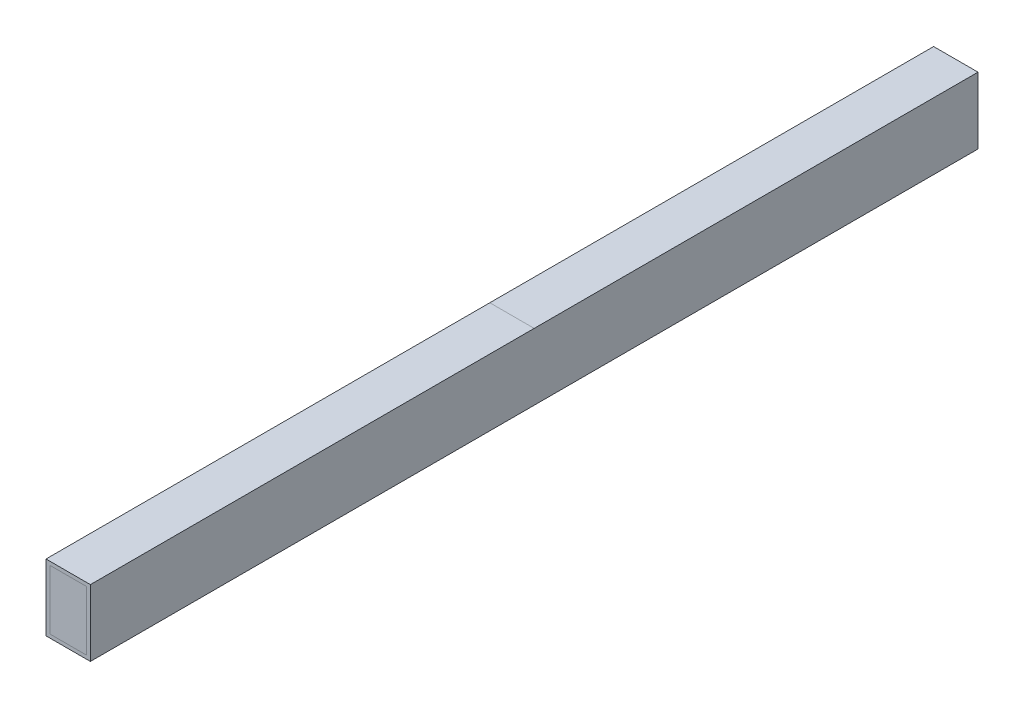
ISO-10303-21;
HEADER;
FILE_DESCRIPTION(('STEP AP214'),'2;1');
FILE_NAME('part.step','',(''),(''),'','','');
FILE_SCHEMA(('AUTOMOTIVE_DESIGN { 1 0 10303 214 1 1 1 1 }'));
ENDSEC;
DATA;
#1=APPLICATION_CONTEXT('core data for automotive mechanical design processes');
#2=APPLICATION_PROTOCOL_DEFINITION('international standard','automotive_design',2000,#1);
#3=PRODUCT_CONTEXT('',#1,'mechanical');
#4=PRODUCT('Part','Part','',(#3));
#5=PRODUCT_RELATED_PRODUCT_CATEGORY('part','',(#4));
#6=PRODUCT_DEFINITION_FORMATION('','',#4);
#7=PRODUCT_DEFINITION_CONTEXT('part definition',#1,'design');
#8=PRODUCT_DEFINITION('design','',#6,#7);
#9=PRODUCT_DEFINITION_SHAPE('','',#8);
#10=(LENGTH_UNIT() NAMED_UNIT(*) SI_UNIT(.MILLI.,.METRE.));
#11=(NAMED_UNIT(*) PLANE_ANGLE_UNIT() SI_UNIT($,.RADIAN.));
#12=(NAMED_UNIT(*) SI_UNIT($,.STERADIAN.) SOLID_ANGLE_UNIT());
#13=UNCERTAINTY_MEASURE_WITH_UNIT(LENGTH_MEASURE(1.E-05),#10,'distance_accuracy_value','');
#14=(GEOMETRIC_REPRESENTATION_CONTEXT(3) GLOBAL_UNCERTAINTY_ASSIGNED_CONTEXT((#13)) GLOBAL_UNIT_ASSIGNED_CONTEXT((#10,
#11,#12)) REPRESENTATION_CONTEXT('',''));
#15=CARTESIAN_POINT('',(0.,0.,0.));
#16=DIRECTION('',(0.,0.,1.));
#17=DIRECTION('',(1.,0.,0.));
#18=AXIS2_PLACEMENT_3D('',#15,#16,#17);
#19=CARTESIAN_POINT('',(0.9,-0.8,-0.01000000000001));
#20=DIRECTION('',(0.,1.,0.));
#21=DIRECTION('',(0.,0.,1.));
#22=AXIS2_PLACEMENT_3D('',#19,#20,#21);
#23=PLANE('',#22);
#24=DIRECTION('',(0.,0.,1.));
#25=VECTOR('',#24,1.);
#26=CARTESIAN_POINT('',(9.1,-0.8,-0.01000000000001));
#27=LINE('',#26,#25);
#28=CARTESIAN_POINT('',(9.1,-0.8,0.));
#29=VERTEX_POINT('',#28);
#30=CARTESIAN_POINT('',(9.1,-0.8,200.));
#31=VERTEX_POINT('',#30);
#32=EDGE_CURVE('E12',#29,#31,#27,.T.);
#33=ORIENTED_EDGE('',*,*,#32,.F.);
#34=DIRECTION('',(-1.,0.,0.));
#35=VECTOR('',#34,1.);
#36=CARTESIAN_POINT('',(0.,-0.8,0.));
#37=LINE('',#36,#35);
#38=CARTESIAN_POINT('',(0.9,-0.8,0.));
#39=VERTEX_POINT('',#38);
#40=EDGE_CURVE('E58',#29,#39,#37,.T.);
#41=ORIENTED_EDGE('',*,*,#40,.T.);
#42=DIRECTION('',(0.,0.,1.));
#43=VECTOR('',#42,1.);
#44=CARTESIAN_POINT('',(0.9,-0.8,-0.01000000000001));
#45=LINE('',#44,#43);
#46=CARTESIAN_POINT('',(0.9,-0.8,200.));
#47=VERTEX_POINT('',#46);
#48=EDGE_CURVE('E63',#39,#47,#45,.T.);
#49=ORIENTED_EDGE('',*,*,#48,.T.);
#50=DIRECTION('',(-1.,0.,0.));
#51=VECTOR('',#50,1.);
#52=CARTESIAN_POINT('',(0.,-0.8,200.));
#53=LINE('',#52,#51);
#54=EDGE_CURVE('E103',#31,#47,#53,.T.);
#55=ORIENTED_EDGE('',*,*,#54,.F.);
#56=EDGE_LOOP('',(#33,#41,#49,#55));
#57=FACE_BOUND('',#56,.T.);
#58=ADVANCED_FACE('F54',(#57),#23,.T.);
#59=CARTESIAN_POINT('',(9.1,-0.8,-0.01000000000001));
#60=DIRECTION('',(1.,0.,0.));
#61=DIRECTION('',(0.,1.,0.));
#62=AXIS2_PLACEMENT_3D('',#59,#60,#61);
#63=PLANE('',#62);
#64=DIRECTION('',(0.,0.,1.));
#65=VECTOR('',#64,1.);
#66=CARTESIAN_POINT('',(9.1,-14.2,-0.01000000000001));
#67=LINE('',#66,#65);
#68=CARTESIAN_POINT('',(9.1,-14.2,0.));
#69=VERTEX_POINT('',#68);
#70=CARTESIAN_POINT('',(9.1,-14.2,200.));
#71=VERTEX_POINT('',#70);
#72=EDGE_CURVE('E102',#69,#71,#67,.T.);
#73=ORIENTED_EDGE('',*,*,#72,.F.);
#74=DIRECTION('',(0.,1.,0.));
#75=VECTOR('',#74,1.);
#76=CARTESIAN_POINT('',(9.1,0.,0.));
#77=LINE('',#76,#75);
#78=EDGE_CURVE('E119',#69,#29,#77,.T.);
#79=ORIENTED_EDGE('',*,*,#78,.T.);
#80=ORIENTED_EDGE('',*,*,#32,.T.);
#81=DIRECTION('',(0.,1.,0.));
#82=VECTOR('',#81,1.);
#83=CARTESIAN_POINT('',(9.1,0.,200.));
#84=LINE('',#83,#82);
#85=EDGE_CURVE('E111',#71,#31,#84,.T.);
#86=ORIENTED_EDGE('',*,*,#85,.F.);
#87=EDGE_LOOP('',(#73,#79,#80,#86));
#88=FACE_BOUND('',#87,.T.);
#89=ADVANCED_FACE('F131',(#88),#63,.T.);
#90=CARTESIAN_POINT('',(0.9,-0.8,-0.01000000000001));
#91=DIRECTION('',(-1.,0.,0.));
#92=DIRECTION('',(0.,-1.,0.));
#93=AXIS2_PLACEMENT_3D('',#90,#91,#92);
#94=PLANE('',#93);
#95=ORIENTED_EDGE('',*,*,#48,.F.);
#96=DIRECTION('',(0.,-1.,0.));
#97=VECTOR('',#96,1.);
#98=CARTESIAN_POINT('',(0.9,0.,0.));
#99=LINE('',#98,#97);
#100=CARTESIAN_POINT('',(0.900000000000001,-14.2,0.));
#101=VERTEX_POINT('',#100);
#102=EDGE_CURVE('E98',#39,#101,#99,.T.);
#103=ORIENTED_EDGE('',*,*,#102,.T.);
#104=DIRECTION('',(0.,0.,1.));
#105=VECTOR('',#104,1.);
#106=CARTESIAN_POINT('',(0.900000000000001,-14.2,-0.01000000000001));
#107=LINE('',#106,#105);
#108=CARTESIAN_POINT('',(0.900000000000001,-14.2,200.));
#109=VERTEX_POINT('',#108);
#110=EDGE_CURVE('E92',#101,#109,#107,.T.);
#111=ORIENTED_EDGE('',*,*,#110,.T.);
#112=DIRECTION('',(0.,-1.,0.));
#113=VECTOR('',#112,1.);
#114=CARTESIAN_POINT('',(0.9,0.,200.));
#115=LINE('',#114,#113);
#116=EDGE_CURVE('E96',#47,#109,#115,.T.);
#117=ORIENTED_EDGE('',*,*,#116,.F.);
#118=EDGE_LOOP('',(#95,#103,#111,#117));
#119=FACE_BOUND('',#118,.T.);
#120=ADVANCED_FACE('F94',(#119),#94,.T.);
#121=CARTESIAN_POINT('',(0.900000000000001,-14.2,-0.01000000000001));
#122=DIRECTION('',(0.,-1.,0.));
#123=DIRECTION('',(0.,0.,-1.));
#124=AXIS2_PLACEMENT_3D('',#121,#122,#123);
#125=PLANE('',#124);
#126=ORIENTED_EDGE('',*,*,#110,.F.);
#127=DIRECTION('',(1.,0.,0.));
#128=VECTOR('',#127,1.);
#129=CARTESIAN_POINT('',(0.,-14.2,0.));
#130=LINE('',#129,#128);
#131=EDGE_CURVE('E115',#101,#69,#130,.T.);
#132=ORIENTED_EDGE('',*,*,#131,.T.);
#133=ORIENTED_EDGE('',*,*,#72,.T.);
#134=DIRECTION('',(1.,0.,0.));
#135=VECTOR('',#134,1.);
#136=CARTESIAN_POINT('',(0.,-14.2,200.));
#137=LINE('',#136,#135);
#138=EDGE_CURVE('E106',#109,#71,#137,.T.);
#139=ORIENTED_EDGE('',*,*,#138,.F.);
#140=EDGE_LOOP('',(#126,#132,#133,#139));
#141=FACE_BOUND('',#140,.T.);
#142=ADVANCED_FACE('F107',(#141),#125,.T.);
#143=CARTESIAN_POINT('',(0.,0.,0.));
#144=DIRECTION('',(0.,0.,1.));
#145=DIRECTION('',(1.,0.,0.));
#146=AXIS2_PLACEMENT_3D('',#143,#144,#145);
#147=PLANE('',#146);
#148=ORIENTED_EDGE('',*,*,#102,.F.);
#149=ORIENTED_EDGE('',*,*,#40,.F.);
#150=ORIENTED_EDGE('',*,*,#78,.F.);
#151=ORIENTED_EDGE('',*,*,#131,.F.);
#152=EDGE_LOOP('',(#148,#149,#150,#151));
#153=FACE_BOUND('',#152,.T.);
#154=ADVANCED_FACE('F124',(#153),#147,.F.);
#155=CARTESIAN_POINT('',(0.,0.,200.));
#156=DIRECTION('',(0.,0.,1.));
#157=DIRECTION('',(1.,0.,0.));
#158=AXIS2_PLACEMENT_3D('',#155,#156,#157);
#159=PLANE('',#158);
#160=ORIENTED_EDGE('',*,*,#54,.T.);
#161=ORIENTED_EDGE('',*,*,#116,.T.);
#162=ORIENTED_EDGE('',*,*,#138,.T.);
#163=ORIENTED_EDGE('',*,*,#85,.T.);
#164=EDGE_LOOP('',(#160,#161,#162,#163));
#165=FACE_BOUND('',#164,.T.);
#166=ADVANCED_FACE('F56',(#165),#159,.T.);
#167=CLOSED_SHELL('',(#58,#89,#120,#142,#154,#166));
#168=MANIFOLD_SOLID_BREP('B2',#167);
#169=CARTESIAN_POINT('',(0.9,-0.8,-0.01000000000001));
#170=DIRECTION('',(0.,1.,0.));
#171=DIRECTION('',(0.,0.,1.));
#172=AXIS2_PLACEMENT_3D('',#169,#170,#171);
#173=PLANE('',#172);
#174=DIRECTION('',(0.,0.,1.));
#175=VECTOR('',#174,1.);
#176=CARTESIAN_POINT('',(9.1,-0.8,-0.01000000000001));
#177=LINE('',#176,#175);
#178=CARTESIAN_POINT('',(9.1,-0.8,0.));
#179=VERTEX_POINT('',#178);
#180=CARTESIAN_POINT('',(9.1,-0.8,200.));
#181=VERTEX_POINT('',#180);
#182=EDGE_CURVE('E52',#179,#181,#177,.T.);
#183=ORIENTED_EDGE('',*,*,#182,.T.);
#184=DIRECTION('',(-1.,0.,0.));
#185=VECTOR('',#184,1.);
#186=CARTESIAN_POINT('',(0.,-0.8,200.));
#187=LINE('',#186,#185);
#188=CARTESIAN_POINT('',(0.9,-0.8,200.));
#189=VERTEX_POINT('',#188);
#190=EDGE_CURVE('E293',#181,#189,#187,.T.);
#191=ORIENTED_EDGE('',*,*,#190,.T.);
#192=DIRECTION('',(0.,0.,1.));
#193=VECTOR('',#192,1.);
#194=CARTESIAN_POINT('',(0.9,-0.8,-0.01000000000001));
#195=LINE('',#194,#193);
#196=CARTESIAN_POINT('',(0.9,-0.8,0.));
#197=VERTEX_POINT('',#196);
#198=EDGE_CURVE('E185',#197,#189,#195,.T.);
#199=ORIENTED_EDGE('',*,*,#198,.F.);
#200=DIRECTION('',(-1.,0.,0.));
#201=VECTOR('',#200,1.);
#202=CARTESIAN_POINT('',(0.,-0.8,0.));
#203=LINE('',#202,#201);
#204=EDGE_CURVE('E195',#179,#197,#203,.T.);
#205=ORIENTED_EDGE('',*,*,#204,.F.);
#206=EDGE_LOOP('',(#183,#191,#199,#205));
#207=FACE_BOUND('',#206,.T.);
#208=ADVANCED_FACE('F181',(#207),#173,.F.);
#209=CARTESIAN_POINT('',(9.1,-0.8,-0.01000000000001));
#210=DIRECTION('',(1.,0.,0.));
#211=DIRECTION('',(0.,1.,0.));
#212=AXIS2_PLACEMENT_3D('',#209,#210,#211);
#213=PLANE('',#212);
#214=DIRECTION('',(0.,0.,1.));
#215=VECTOR('',#214,1.);
#216=CARTESIAN_POINT('',(9.1,-14.2,-0.01000000000001));
#217=LINE('',#216,#215);
#218=CARTESIAN_POINT('',(9.1,-14.2,0.));
#219=VERTEX_POINT('',#218);
#220=CARTESIAN_POINT('',(9.1,-14.2,200.));
#221=VERTEX_POINT('',#220);
#222=EDGE_CURVE('E306',#219,#221,#217,.T.);
#223=ORIENTED_EDGE('',*,*,#222,.T.);
#224=DIRECTION('',(0.,1.,0.));
#225=VECTOR('',#224,1.);
#226=CARTESIAN_POINT('',(9.1,0.,200.));
#227=LINE('',#226,#225);
#228=EDGE_CURVE('E296',#221,#181,#227,.T.);
#229=ORIENTED_EDGE('',*,*,#228,.T.);
#230=ORIENTED_EDGE('',*,*,#182,.F.);
#231=DIRECTION('',(0.,1.,0.));
#232=VECTOR('',#231,1.);
#233=CARTESIAN_POINT('',(9.1,0.,0.));
#234=LINE('',#233,#232);
#235=EDGE_CURVE('E285',#219,#179,#234,.T.);
#236=ORIENTED_EDGE('',*,*,#235,.F.);
#237=EDGE_LOOP('',(#223,#229,#230,#236));
#238=FACE_BOUND('',#237,.T.);
#239=ADVANCED_FACE('F358',(#238),#213,.F.);
#240=CARTESIAN_POINT('',(0.900000000000001,-14.2,-0.01000000000001));
#241=DIRECTION('',(0.,-1.,0.));
#242=DIRECTION('',(0.,0.,-1.));
#243=AXIS2_PLACEMENT_3D('',#240,#241,#242);
#244=PLANE('',#243);
#245=DIRECTION('',(0.,0.,1.));
#246=VECTOR('',#245,1.);
#247=CARTESIAN_POINT('',(0.900000000000001,-14.2,-0.01000000000001));
#248=LINE('',#247,#246);
#249=CARTESIAN_POINT('',(0.900000000000001,-14.2,0.));
#250=VERTEX_POINT('',#249);
#251=CARTESIAN_POINT('',(0.900000000000001,-14.2,200.));
#252=VERTEX_POINT('',#251);
#253=EDGE_CURVE('E295',#250,#252,#248,.T.);
#254=ORIENTED_EDGE('',*,*,#253,.T.);
#255=DIRECTION('',(1.,0.,0.));
#256=VECTOR('',#255,1.);
#257=CARTESIAN_POINT('',(0.,-14.2,200.));
#258=LINE('',#257,#256);
#259=EDGE_CURVE('E299',#252,#221,#258,.T.);
#260=ORIENTED_EDGE('',*,*,#259,.T.);
#261=ORIENTED_EDGE('',*,*,#222,.F.);
#262=DIRECTION('',(1.,0.,0.));
#263=VECTOR('',#262,1.);
#264=CARTESIAN_POINT('',(0.,-14.2,0.));
#265=LINE('',#264,#263);
#266=EDGE_CURVE('E287',#250,#219,#265,.T.);
#267=ORIENTED_EDGE('',*,*,#266,.F.);
#268=EDGE_LOOP('',(#254,#260,#261,#267));
#269=FACE_BOUND('',#268,.T.);
#270=ADVANCED_FACE('F317',(#269),#244,.F.);
#271=CARTESIAN_POINT('',(0.9,-0.8,-0.01000000000001));
#272=DIRECTION('',(-1.,0.,0.));
#273=DIRECTION('',(0.,-1.,0.));
#274=AXIS2_PLACEMENT_3D('',#271,#272,#273);
#275=PLANE('',#274);
#276=ORIENTED_EDGE('',*,*,#198,.T.);
#277=DIRECTION('',(0.,-1.,0.));
#278=VECTOR('',#277,1.);
#279=CARTESIAN_POINT('',(0.9,0.,200.));
#280=LINE('',#279,#278);
#281=EDGE_CURVE('E292',#189,#252,#280,.T.);
#282=ORIENTED_EDGE('',*,*,#281,.T.);
#283=ORIENTED_EDGE('',*,*,#253,.F.);
#284=DIRECTION('',(0.,-1.,0.));
#285=VECTOR('',#284,1.);
#286=CARTESIAN_POINT('',(0.9,0.,0.));
#287=LINE('',#286,#285);
#288=EDGE_CURVE('E290',#197,#250,#287,.T.);
#289=ORIENTED_EDGE('',*,*,#288,.F.);
#290=EDGE_LOOP('',(#276,#282,#283,#289));
#291=FACE_BOUND('',#290,.T.);
#292=ADVANCED_FACE('F183',(#291),#275,.F.);
#293=CARTESIAN_POINT('',(0.,0.,200.));
#294=DIRECTION('',(0.,-1.,0.));
#295=DIRECTION('',(0.,0.,-1.));
#296=AXIS2_PLACEMENT_3D('',#293,#294,#295);
#297=PLANE('',#296);
#298=DIRECTION('',(1.,0.,0.));
#299=VECTOR('',#298,1.);
#300=CARTESIAN_POINT('',(0.,0.,100.));
#301=LINE('',#300,#299);
#302=CARTESIAN_POINT('',(0.,0.,100.));
#303=VERTEX_POINT('',#302);
#304=CARTESIAN_POINT('',(10.,0.,100.));
#305=VERTEX_POINT('',#304);
#306=EDGE_CURVE('E276',#303,#305,#301,.T.);
#307=ORIENTED_EDGE('',*,*,#306,.F.);
#308=DIRECTION('',(0.,0.,-1.));
#309=VECTOR('',#308,1.);
#310=CARTESIAN_POINT('',(0.,0.,200.));
#311=LINE('',#310,#309);
#312=CARTESIAN_POINT('',(0.,0.,200.));
#313=VERTEX_POINT('',#312);
#314=EDGE_CURVE('E335',#313,#303,#311,.T.);
#315=ORIENTED_EDGE('',*,*,#314,.F.);
#316=DIRECTION('',(-1.,0.,0.));
#317=VECTOR('',#316,1.);
#318=CARTESIAN_POINT('',(0.,0.,200.));
#319=LINE('',#318,#317);
#320=CARTESIAN_POINT('',(10.,0.,200.));
#321=VERTEX_POINT('',#320);
#322=EDGE_CURVE('E267',#321,#313,#319,.T.);
#323=ORIENTED_EDGE('',*,*,#322,.F.);
#324=DIRECTION('',(0.,0.,-1.));
#325=VECTOR('',#324,1.);
#326=CARTESIAN_POINT('',(10.,0.,200.));
#327=LINE('',#326,#325);
#328=EDGE_CURVE('E280',#321,#305,#327,.T.);
#329=ORIENTED_EDGE('',*,*,#328,.T.);
#330=EDGE_LOOP('',(#307,#315,#323,#329));
#331=FACE_BOUND('',#330,.T.);
#332=ADVANCED_FACE('F347',(#331),#297,.F.);
#333=CARTESIAN_POINT('',(0.,-15.,200.));
#334=DIRECTION('',(0.,1.,0.));
#335=DIRECTION('',(0.,0.,1.));
#336=AXIS2_PLACEMENT_3D('',#333,#334,#335);
#337=PLANE('',#336);
#338=DIRECTION('',(1.,0.,0.));
#339=VECTOR('',#338,1.);
#340=CARTESIAN_POINT('',(0.,-15.,0.));
#341=LINE('',#340,#339);
#342=CARTESIAN_POINT('',(0.,-15.,0.));
#343=VERTEX_POINT('',#342);
#344=CARTESIAN_POINT('',(10.,-15.,0.));
#345=VERTEX_POINT('',#344);
#346=EDGE_CURVE('E325',#343,#345,#341,.T.);
#347=ORIENTED_EDGE('',*,*,#346,.T.);
#348=DIRECTION('',(0.,0.,-1.));
#349=VECTOR('',#348,1.);
#350=CARTESIAN_POINT('',(10.,-15.,200.));
#351=LINE('',#350,#349);
#352=CARTESIAN_POINT('',(10.,-15.,200.));
#353=VERTEX_POINT('',#352);
#354=EDGE_CURVE('E258',#353,#345,#351,.T.);
#355=ORIENTED_EDGE('',*,*,#354,.F.);
#356=DIRECTION('',(1.,0.,0.));
#357=VECTOR('',#356,1.);
#358=CARTESIAN_POINT('',(0.,-15.,200.));
#359=LINE('',#358,#357);
#360=CARTESIAN_POINT('',(0.,-15.,200.));
#361=VERTEX_POINT('',#360);
#362=EDGE_CURVE('E251',#361,#353,#359,.T.);
#363=ORIENTED_EDGE('',*,*,#362,.F.);
#364=DIRECTION('',(0.,0.,-1.));
#365=VECTOR('',#364,1.);
#366=CARTESIAN_POINT('',(0.,-15.,200.));
#367=LINE('',#366,#365);
#368=EDGE_CURVE('E255',#361,#343,#367,.T.);
#369=ORIENTED_EDGE('',*,*,#368,.T.);
#370=EDGE_LOOP('',(#347,#355,#363,#369));
#371=FACE_BOUND('',#370,.T.);
#372=ADVANCED_FACE('F253',(#371),#337,.F.);
#373=CARTESIAN_POINT('',(10.,0.,200.));
#374=DIRECTION('',(-1.,0.,0.));
#375=DIRECTION('',(0.,-1.,0.));
#376=AXIS2_PLACEMENT_3D('',#373,#374,#375);
#377=PLANE('',#376);
#378=DIRECTION('',(0.,1.,0.));
#379=VECTOR('',#378,1.);
#380=CARTESIAN_POINT('',(10.,0.,0.));
#381=LINE('',#380,#379);
#382=CARTESIAN_POINT('',(10.,0.,0.));
#383=VERTEX_POINT('',#382);
#384=EDGE_CURVE('E327',#345,#383,#381,.T.);
#385=ORIENTED_EDGE('',*,*,#384,.T.);
#386=EDGE_CURVE('E336',#305,#383,#327,.T.);
#387=ORIENTED_EDGE('',*,*,#386,.F.);
#388=ORIENTED_EDGE('',*,*,#328,.F.);
#389=DIRECTION('',(0.,1.,0.));
#390=VECTOR('',#389,1.);
#391=CARTESIAN_POINT('',(10.,0.,200.));
#392=LINE('',#391,#390);
#393=EDGE_CURVE('E261',#353,#321,#392,.T.);
#394=ORIENTED_EDGE('',*,*,#393,.F.);
#395=ORIENTED_EDGE('',*,*,#354,.T.);
#396=EDGE_LOOP('',(#385,#387,#388,#394,#395));
#397=FACE_BOUND('',#396,.T.);
#398=ADVANCED_FACE('F346',(#397),#377,.F.);
#399=CARTESIAN_POINT('',(0.,0.,0.));
#400=VERTEX_POINT('',#399);
#401=EDGE_CURVE('E337',#303,#400,#311,.T.);
#402=ORIENTED_EDGE('',*,*,#401,.F.);
#403=ORIENTED_EDGE('',*,*,#306,.T.);
#404=ORIENTED_EDGE('',*,*,#386,.T.);
#405=DIRECTION('',(-1.,0.,0.));
#406=VECTOR('',#405,1.);
#407=CARTESIAN_POINT('',(0.,0.,0.));
#408=LINE('',#407,#406);
#409=EDGE_CURVE('E271',#383,#400,#408,.T.);
#410=ORIENTED_EDGE('',*,*,#409,.T.);
#411=EDGE_LOOP('',(#402,#403,#404,#410));
#412=FACE_BOUND('',#411,.T.);
#413=ADVANCED_FACE('F344',(#412),#297,.F.);
#414=CARTESIAN_POINT('',(0.,0.,200.));
#415=DIRECTION('',(1.,0.,0.));
#416=DIRECTION('',(0.,1.,0.));
#417=AXIS2_PLACEMENT_3D('',#414,#415,#416);
#418=PLANE('',#417);
#419=DIRECTION('',(0.,-1.,0.));
#420=VECTOR('',#419,1.);
#421=CARTESIAN_POINT('',(0.,0.,0.));
#422=LINE('',#421,#420);
#423=EDGE_CURVE('E275',#400,#343,#422,.T.);
#424=ORIENTED_EDGE('',*,*,#423,.T.);
#425=ORIENTED_EDGE('',*,*,#368,.F.);
#426=DIRECTION('',(0.,-1.,0.));
#427=VECTOR('',#426,1.);
#428=CARTESIAN_POINT('',(0.,0.,200.));
#429=LINE('',#428,#427);
#430=EDGE_CURVE('E262',#313,#361,#429,.T.);
#431=ORIENTED_EDGE('',*,*,#430,.F.);
#432=ORIENTED_EDGE('',*,*,#314,.T.);
#433=ORIENTED_EDGE('',*,*,#401,.T.);
#434=EDGE_LOOP('',(#424,#425,#431,#432,#433));
#435=FACE_BOUND('',#434,.T.);
#436=ADVANCED_FACE('F273',(#435),#418,.F.);
#437=CARTESIAN_POINT('',(0.,0.,0.));
#438=DIRECTION('',(0.,0.,1.));
#439=DIRECTION('',(1.,0.,0.));
#440=AXIS2_PLACEMENT_3D('',#437,#438,#439);
#441=PLANE('',#440);
#442=ORIENTED_EDGE('',*,*,#204,.T.);
#443=ORIENTED_EDGE('',*,*,#288,.T.);
#444=ORIENTED_EDGE('',*,*,#266,.T.);
#445=ORIENTED_EDGE('',*,*,#235,.T.);
#446=EDGE_LOOP('',(#442,#443,#444,#445));
#447=FACE_BOUND('',#446,.T.);
#448=ORIENTED_EDGE('',*,*,#423,.F.);
#449=ORIENTED_EDGE('',*,*,#409,.F.);
#450=ORIENTED_EDGE('',*,*,#384,.F.);
#451=ORIENTED_EDGE('',*,*,#346,.F.);
#452=EDGE_LOOP('',(#448,#449,#450,#451));
#453=FACE_BOUND('',#452,.T.);
#454=ADVANCED_FACE('F318',(#447,#453),#441,.F.);
#455=CARTESIAN_POINT('',(0.,0.,200.));
#456=DIRECTION('',(0.,0.,1.));
#457=DIRECTION('',(1.,0.,0.));
#458=AXIS2_PLACEMENT_3D('',#455,#456,#457);
#459=PLANE('',#458);
#460=ORIENTED_EDGE('',*,*,#281,.F.);
#461=ORIENTED_EDGE('',*,*,#190,.F.);
#462=ORIENTED_EDGE('',*,*,#228,.F.);
#463=ORIENTED_EDGE('',*,*,#259,.F.);
#464=EDGE_LOOP('',(#460,#461,#462,#463));
#465=FACE_BOUND('',#464,.T.);
#466=ORIENTED_EDGE('',*,*,#430,.T.);
#467=ORIENTED_EDGE('',*,*,#362,.T.);
#468=ORIENTED_EDGE('',*,*,#393,.T.);
#469=ORIENTED_EDGE('',*,*,#322,.T.);
#470=EDGE_LOOP('',(#466,#467,#468,#469));
#471=FACE_BOUND('',#470,.T.);
#472=ADVANCED_FACE('F265',(#465,#471),#459,.T.);
#473=CLOSED_SHELL('',(#208,#239,#270,#292,#332,#372,#398,#413,#436,#454,#472));
#474=MANIFOLD_SOLID_BREP('B6',#473);
#475=ADVANCED_BREP_SHAPE_REPRESENTATION('',(#18,#168,#474),#14);
#476=SHAPE_DEFINITION_REPRESENTATION(#9,#475);
ENDSEC;
END-ISO-10303-21;
